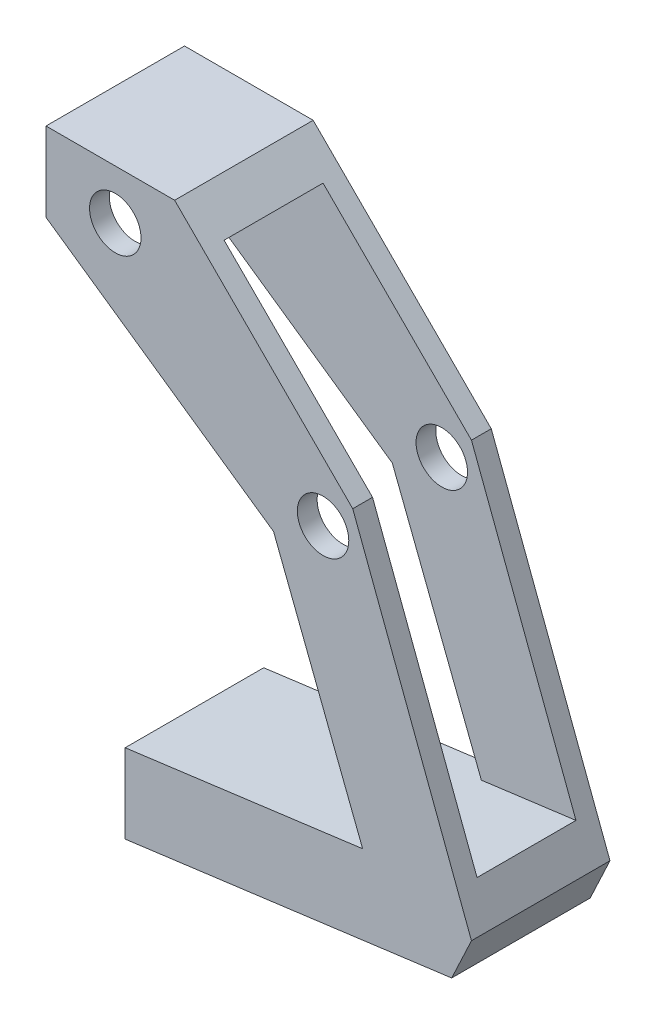
ISO-10303-21;
HEADER;
FILE_DESCRIPTION(('STEP AP214'),'2;1');
FILE_NAME('part.step','',(''),(''),'','','');
FILE_SCHEMA(('AUTOMOTIVE_DESIGN { 1 0 10303 214 1 1 1 1 }'));
ENDSEC;
DATA;
#1=APPLICATION_CONTEXT('core data for automotive mechanical design processes');
#2=APPLICATION_PROTOCOL_DEFINITION('international standard','automotive_design',2000,#1);
#3=PRODUCT_CONTEXT('',#1,'mechanical');
#4=PRODUCT('Part','Part','',(#3));
#5=PRODUCT_RELATED_PRODUCT_CATEGORY('part','',(#4));
#6=PRODUCT_DEFINITION_FORMATION('','',#4);
#7=PRODUCT_DEFINITION_CONTEXT('part definition',#1,'design');
#8=PRODUCT_DEFINITION('design','',#6,#7);
#9=PRODUCT_DEFINITION_SHAPE('','',#8);
#10=(LENGTH_UNIT() NAMED_UNIT(*) SI_UNIT(.MILLI.,.METRE.));
#11=(NAMED_UNIT(*) PLANE_ANGLE_UNIT() SI_UNIT($,.RADIAN.));
#12=(NAMED_UNIT(*) SI_UNIT($,.STERADIAN.) SOLID_ANGLE_UNIT());
#13=UNCERTAINTY_MEASURE_WITH_UNIT(LENGTH_MEASURE(1.E-05),#10,'distance_accuracy_value','');
#14=(GEOMETRIC_REPRESENTATION_CONTEXT(3) GLOBAL_UNCERTAINTY_ASSIGNED_CONTEXT((#13)) GLOBAL_UNIT_ASSIGNED_CONTEXT((#10,
#11,#12)) REPRESENTATION_CONTEXT('',''));
#15=CARTESIAN_POINT('',(0.,0.,0.));
#16=DIRECTION('',(0.,0.,1.));
#17=DIRECTION('',(1.,0.,0.));
#18=AXIS2_PLACEMENT_3D('',#15,#16,#17);
#19=CARTESIAN_POINT('',(65.,57.,2.));
#20=DIRECTION('',(0.,1.,0.));
#21=DIRECTION('',(0.,0.,1.));
#22=AXIS2_PLACEMENT_3D('',#19,#20,#21);
#23=PLANE('',#22);
#24=DIRECTION('',(-1.,0.,0.));
#25=VECTOR('',#24,1.);
#26=CARTESIAN_POINT('',(65.,57.,2.));
#27=LINE('',#26,#25);
#28=CARTESIAN_POINT('',(17.3386752274164,57.,2.));
#29=VERTEX_POINT('',#28);
#30=CARTESIAN_POINT('',(12.,57.,2.));
#31=VERTEX_POINT('',#30);
#32=EDGE_CURVE('E177',#29,#31,#27,.T.);
#33=ORIENTED_EDGE('',*,*,#32,.F.);
#34=DIRECTION('',(0.,0.,1.));
#35=VECTOR('',#34,1.);
#36=CARTESIAN_POINT('',(17.3386752274164,57.,0.));
#37=LINE('',#36,#35);
#38=CARTESIAN_POINT('',(17.3386752274164,57.,12.));
#39=VERTEX_POINT('',#38);
#40=EDGE_CURVE('E168',#29,#39,#37,.T.);
#41=ORIENTED_EDGE('',*,*,#40,.T.);
#42=DIRECTION('',(-1.,0.,0.));
#43=VECTOR('',#42,1.);
#44=CARTESIAN_POINT('',(65.,57.,12.));
#45=LINE('',#44,#43);
#46=CARTESIAN_POINT('',(12.,57.,12.));
#47=VERTEX_POINT('',#46);
#48=EDGE_CURVE('E175',#39,#47,#45,.T.);
#49=ORIENTED_EDGE('',*,*,#48,.T.);
#50=DIRECTION('',(0.,0.,1.));
#51=VECTOR('',#50,1.);
#52=CARTESIAN_POINT('',(12.,57.,14.));
#53=LINE('',#52,#51);
#54=EDGE_CURVE('E212',#31,#47,#53,.T.);
#55=ORIENTED_EDGE('',*,*,#54,.F.);
#56=EDGE_LOOP('',(#33,#41,#49,#55));
#57=FACE_BOUND('',#56,.T.);
#58=ADVANCED_FACE('F39',(#57),#23,.F.);
#59=CARTESIAN_POINT('',(35.,36.,14.));
#60=DIRECTION('',(0.5710644881986,0.820905201785487,0.));
#61=DIRECTION('',(-0.820905201785487,0.5710644881986,0.));
#62=AXIS2_PLACEMENT_3D('',#59,#60,#61);
#63=PLANE('',#62);
#64=DIRECTION('',(-0.820905201785487,0.5710644881986,0.));
#65=VECTOR('',#64,1.);
#66=CARTESIAN_POINT('',(35.,36.,12.));
#67=LINE('',#66,#65);
#68=CARTESIAN_POINT('',(35.,36.,12.));
#69=VERTEX_POINT('',#68);
#70=CARTESIAN_POINT('',(12.,52.,12.));
#71=VERTEX_POINT('',#70);
#72=EDGE_CURVE('E197',#69,#71,#67,.T.);
#73=ORIENTED_EDGE('',*,*,#72,.F.);
#74=DIRECTION('',(0.,0.,-1.));
#75=VECTOR('',#74,1.);
#76=CARTESIAN_POINT('',(35.,36.,14.));
#77=LINE('',#76,#75);
#78=CARTESIAN_POINT('',(35.,36.,14.));
#79=VERTEX_POINT('',#78);
#80=EDGE_CURVE('E286',#79,#69,#77,.T.);
#81=ORIENTED_EDGE('',*,*,#80,.F.);
#82=DIRECTION('',(0.820905201785487,-0.5710644881986,0.));
#83=VECTOR('',#82,1.);
#84=CARTESIAN_POINT('',(35.,36.,14.));
#85=LINE('',#84,#83);
#86=CARTESIAN_POINT('',(12.,52.,14.));
#87=VERTEX_POINT('',#86);
#88=EDGE_CURVE('E218',#87,#79,#85,.T.);
#89=ORIENTED_EDGE('',*,*,#88,.F.);
#90=DIRECTION('',(0.,0.,-1.));
#91=VECTOR('',#90,1.);
#92=CARTESIAN_POINT('',(12.,52.,14.));
#93=LINE('',#92,#91);
#94=EDGE_CURVE('E290',#87,#71,#93,.T.);
#95=ORIENTED_EDGE('',*,*,#94,.T.);
#96=EDGE_LOOP('',(#73,#81,#89,#95));
#97=FACE_BOUND('',#96,.T.);
#98=ADVANCED_FACE('F377',(#97),#63,.F.);
#99=CARTESIAN_POINT('',(44.,12.7394899131463,14.));
#100=DIRECTION('',(0.932623002789676,0.360852233840346,0.));
#101=DIRECTION('',(-0.360852233840346,0.932623002789676,0.));
#102=AXIS2_PLACEMENT_3D('',#99,#100,#101);
#103=PLANE('',#102);
#104=DIRECTION('',(-0.360852233840346,0.932623002789676,0.));
#105=VECTOR('',#104,1.);
#106=CARTESIAN_POINT('',(44.,12.7394899131463,12.));
#107=LINE('',#106,#105);
#108=CARTESIAN_POINT('',(44.,12.7394899131463,12.));
#109=VERTEX_POINT('',#108);
#110=EDGE_CURVE('E194',#109,#69,#107,.T.);
#111=ORIENTED_EDGE('',*,*,#110,.F.);
#112=DIRECTION('',(0.,0.,-1.));
#113=VECTOR('',#112,1.);
#114=CARTESIAN_POINT('',(44.,12.7394899131463,14.));
#115=LINE('',#114,#113);
#116=CARTESIAN_POINT('',(44.,12.7394899131463,14.));
#117=VERTEX_POINT('',#116);
#118=EDGE_CURVE('E282',#117,#109,#115,.T.);
#119=ORIENTED_EDGE('',*,*,#118,.F.);
#120=DIRECTION('',(0.360852233840346,-0.932623002789676,0.));
#121=VECTOR('',#120,1.);
#122=CARTESIAN_POINT('',(44.,12.7394899131463,14.));
#123=LINE('',#122,#121);
#124=EDGE_CURVE('E221',#79,#117,#123,.T.);
#125=ORIENTED_EDGE('',*,*,#124,.F.);
#126=ORIENTED_EDGE('',*,*,#80,.T.);
#127=EDGE_LOOP('',(#111,#119,#125,#126));
#128=FACE_BOUND('',#127,.T.);
#129=ADVANCED_FACE('F381',(#128),#103,.F.);
#130=CARTESIAN_POINT('',(12.,52.,14.));
#131=DIRECTION('',(1.,0.,0.));
#132=DIRECTION('',(0.,0.,-1.));
#133=AXIS2_PLACEMENT_3D('',#130,#131,#132);
#134=PLANE('',#133);
#135=CARTESIAN_POINT('',(12.,52.,2.));
#136=VERTEX_POINT('',#135);
#137=CARTESIAN_POINT('',(12.,52.,0.));
#138=VERTEX_POINT('',#137);
#139=EDGE_CURVE('E289',#136,#138,#93,.T.);
#140=ORIENTED_EDGE('',*,*,#139,.F.);
#141=DIRECTION('',(0.,1.,0.));
#142=VECTOR('',#141,1.);
#143=CARTESIAN_POINT('',(12.,52.,2.));
#144=LINE('',#143,#142);
#145=EDGE_CURVE('E209',#136,#31,#144,.T.);
#146=ORIENTED_EDGE('',*,*,#145,.T.);
#147=ORIENTED_EDGE('',*,*,#54,.T.);
#148=DIRECTION('',(0.,1.,0.));
#149=VECTOR('',#148,1.);
#150=CARTESIAN_POINT('',(12.,52.,12.));
#151=LINE('',#150,#149);
#152=EDGE_CURVE('E183',#71,#47,#151,.T.);
#153=ORIENTED_EDGE('',*,*,#152,.F.);
#154=ORIENTED_EDGE('',*,*,#94,.F.);
#155=DIRECTION('',(0.,-1.,0.));
#156=VECTOR('',#155,1.);
#157=CARTESIAN_POINT('',(12.,52.,14.));
#158=LINE('',#157,#156);
#159=CARTESIAN_POINT('',(12.,60.,14.));
#160=VERTEX_POINT('',#159);
#161=EDGE_CURVE('E215',#160,#87,#158,.T.);
#162=ORIENTED_EDGE('',*,*,#161,.F.);
#163=DIRECTION('',(0.,0.,-1.));
#164=VECTOR('',#163,1.);
#165=CARTESIAN_POINT('',(12.,60.,14.));
#166=LINE('',#165,#164);
#167=CARTESIAN_POINT('',(12.,60.,0.));
#168=VERTEX_POINT('',#167);
#169=EDGE_CURVE('E237',#160,#168,#166,.T.);
#170=ORIENTED_EDGE('',*,*,#169,.T.);
#171=DIRECTION('',(0.,-1.,0.));
#172=VECTOR('',#171,1.);
#173=CARTESIAN_POINT('',(12.,52.,0.));
#174=LINE('',#173,#172);
#175=EDGE_CURVE('E214',#168,#138,#174,.T.);
#176=ORIENTED_EDGE('',*,*,#175,.T.);
#177=EDGE_LOOP('',(#140,#146,#147,#153,#154,#162,#170,#176));
#178=FACE_BOUND('',#177,.T.);
#179=ADVANCED_FACE('F41',(#178),#134,.F.);
#180=CARTESIAN_POINT('',(35.,36.,2.));
#181=VERTEX_POINT('',#180);
#182=CARTESIAN_POINT('',(35.,36.,0.));
#183=VERTEX_POINT('',#182);
#184=EDGE_CURVE('E285',#181,#183,#77,.T.);
#185=ORIENTED_EDGE('',*,*,#184,.F.);
#186=DIRECTION('',(-0.820905201785487,0.5710644881986,0.));
#187=VECTOR('',#186,1.);
#188=CARTESIAN_POINT('',(35.,36.,2.));
#189=LINE('',#188,#187);
#190=EDGE_CURVE('E206',#181,#136,#189,.T.);
#191=ORIENTED_EDGE('',*,*,#190,.T.);
#192=ORIENTED_EDGE('',*,*,#139,.T.);
#193=DIRECTION('',(0.820905201785487,-0.5710644881986,0.));
#194=VECTOR('',#193,1.);
#195=CARTESIAN_POINT('',(35.,36.,0.));
#196=LINE('',#195,#194);
#197=EDGE_CURVE('E240',#138,#183,#196,.T.);
#198=ORIENTED_EDGE('',*,*,#197,.T.);
#199=EDGE_LOOP('',(#185,#191,#192,#198));
#200=FACE_BOUND('',#199,.T.);
#201=ADVANCED_FACE('F329',(#200),#63,.F.);
#202=CARTESIAN_POINT('',(44.,12.7394899131462,2.));
#203=VERTEX_POINT('',#202);
#204=CARTESIAN_POINT('',(44.,12.7394899131463,0.));
#205=VERTEX_POINT('',#204);
#206=EDGE_CURVE('E281',#203,#205,#115,.T.);
#207=ORIENTED_EDGE('',*,*,#206,.F.);
#208=DIRECTION('',(-0.360852233840346,0.932623002789676,0.));
#209=VECTOR('',#208,1.);
#210=CARTESIAN_POINT('',(44.,12.7394899131463,2.));
#211=LINE('',#210,#209);
#212=EDGE_CURVE('E203',#203,#181,#211,.T.);
#213=ORIENTED_EDGE('',*,*,#212,.T.);
#214=ORIENTED_EDGE('',*,*,#184,.T.);
#215=DIRECTION('',(0.360852233840346,-0.932623002789676,0.));
#216=VECTOR('',#215,1.);
#217=CARTESIAN_POINT('',(44.,12.7394899131463,0.));
#218=LINE('',#217,#216);
#219=EDGE_CURVE('E243',#183,#205,#218,.T.);
#220=ORIENTED_EDGE('',*,*,#219,.T.);
#221=EDGE_LOOP('',(#207,#213,#214,#220));
#222=FACE_BOUND('',#221,.T.);
#223=ADVANCED_FACE('F338',(#222),#103,.F.);
#224=CARTESIAN_POINT('',(20.,9.57982997104875,14.));
#225=DIRECTION('',(0.130526192220052,-0.99144486137381,0.));
#226=DIRECTION('',(0.99144486137381,0.130526192220052,0.));
#227=AXIS2_PLACEMENT_3D('',#224,#225,#226);
#228=PLANE('',#227);
#229=DIRECTION('',(-0.99144486137381,-0.130526192220052,0.));
#230=VECTOR('',#229,1.);
#231=CARTESIAN_POINT('',(20.,9.57982997104875,0.));
#232=LINE('',#231,#230);
#233=CARTESIAN_POINT('',(20.,9.57982997104875,0.));
#234=VERTEX_POINT('',#233);
#235=EDGE_CURVE('E246',#205,#234,#232,.T.);
#236=ORIENTED_EDGE('',*,*,#235,.T.);
#237=DIRECTION('',(0.,0.,-1.));
#238=VECTOR('',#237,1.);
#239=CARTESIAN_POINT('',(20.,9.57982997104875,14.));
#240=LINE('',#239,#238);
#241=CARTESIAN_POINT('',(20.,9.57982997104875,14.));
#242=VERTEX_POINT('',#241);
#243=EDGE_CURVE('E279',#242,#234,#240,.T.);
#244=ORIENTED_EDGE('',*,*,#243,.F.);
#245=DIRECTION('',(-0.99144486137381,-0.130526192220052,0.));
#246=VECTOR('',#245,1.);
#247=CARTESIAN_POINT('',(20.,9.57982997104875,14.));
#248=LINE('',#247,#246);
#249=EDGE_CURVE('E223',#117,#242,#248,.T.);
#250=ORIENTED_EDGE('',*,*,#249,.F.);
#251=ORIENTED_EDGE('',*,*,#118,.T.);
#252=DIRECTION('',(0.99144486137381,0.130526192220052,0.));
#253=VECTOR('',#252,1.);
#254=CARTESIAN_POINT('',(-5.,6.28851753136385,12.));
#255=LINE('',#254,#253);
#256=CARTESIAN_POINT('',(53.5625369462484,13.9984217853916,12.));
#257=VERTEX_POINT('',#256);
#258=EDGE_CURVE('E61',#109,#257,#255,.T.);
#259=ORIENTED_EDGE('',*,*,#258,.T.);
#260=DIRECTION('',(0.,0.,1.));
#261=VECTOR('',#260,1.);
#262=CARTESIAN_POINT('',(53.5625369462484,13.9984217853916,14.));
#263=LINE('',#262,#261);
#264=CARTESIAN_POINT('',(53.5625369462484,13.9984217853916,2.));
#265=VERTEX_POINT('',#264);
#266=EDGE_CURVE('E47',#265,#257,#263,.T.);
#267=ORIENTED_EDGE('',*,*,#266,.F.);
#268=DIRECTION('',(0.99144486137381,0.130526192220052,0.));
#269=VECTOR('',#268,1.);
#270=CARTESIAN_POINT('',(-5.,6.28851753136385,2.));
#271=LINE('',#270,#269);
#272=EDGE_CURVE('E187',#203,#265,#271,.T.);
#273=ORIENTED_EDGE('',*,*,#272,.F.);
#274=ORIENTED_EDGE('',*,*,#206,.T.);
#275=EDGE_LOOP('',(#236,#244,#250,#251,#259,#267,#273,#274));
#276=FACE_BOUND('',#275,.T.);
#277=ADVANCED_FACE('F341',(#276),#228,.F.);
#278=CARTESIAN_POINT('',(20.,1.57982997104875,14.));
#279=DIRECTION('',(1.,0.,0.));
#280=DIRECTION('',(0.,0.,-1.));
#281=AXIS2_PLACEMENT_3D('',#278,#279,#280);
#282=PLANE('',#281);
#283=DIRECTION('',(0.,-1.,0.));
#284=VECTOR('',#283,1.);
#285=CARTESIAN_POINT('',(20.,1.57982997104875,0.));
#286=LINE('',#285,#284);
#287=CARTESIAN_POINT('',(20.,1.57982997104875,0.));
#288=VERTEX_POINT('',#287);
#289=EDGE_CURVE('E249',#234,#288,#286,.T.);
#290=ORIENTED_EDGE('',*,*,#289,.T.);
#291=DIRECTION('',(0.,0.,-1.));
#292=VECTOR('',#291,1.);
#293=CARTESIAN_POINT('',(20.,1.57982997104875,14.));
#294=LINE('',#293,#292);
#295=CARTESIAN_POINT('',(20.,1.57982997104875,14.));
#296=VERTEX_POINT('',#295);
#297=EDGE_CURVE('E276',#296,#288,#294,.T.);
#298=ORIENTED_EDGE('',*,*,#297,.F.);
#299=DIRECTION('',(0.,-1.,0.));
#300=VECTOR('',#299,1.);
#301=CARTESIAN_POINT('',(20.,1.57982997104875,14.));
#302=LINE('',#301,#300);
#303=EDGE_CURVE('E225',#242,#296,#302,.T.);
#304=ORIENTED_EDGE('',*,*,#303,.F.);
#305=ORIENTED_EDGE('',*,*,#243,.T.);
#306=EDGE_LOOP('',(#290,#298,#304,#305));
#307=FACE_BOUND('',#306,.T.);
#308=ADVANCED_FACE('F387',(#307),#282,.F.);
#309=CARTESIAN_POINT('',(53.,5.92436239143281,14.));
#310=DIRECTION('',(-0.130526192220052,0.99144486137381,0.));
#311=DIRECTION('',(-0.99144486137381,-0.130526192220052,0.));
#312=AXIS2_PLACEMENT_3D('',#309,#310,#311);
#313=PLANE('',#312);
#314=DIRECTION('',(0.99144486137381,0.130526192220052,0.));
#315=VECTOR('',#314,1.);
#316=CARTESIAN_POINT('',(53.,5.92436239143281,0.));
#317=LINE('',#316,#315);
#318=CARTESIAN_POINT('',(53.,5.92436239143281,0.));
#319=VERTEX_POINT('',#318);
#320=EDGE_CURVE('E251',#288,#319,#317,.T.);
#321=ORIENTED_EDGE('',*,*,#320,.T.);
#322=DIRECTION('',(0.,0.,-1.));
#323=VECTOR('',#322,1.);
#324=CARTESIAN_POINT('',(53.,5.92436239143281,14.));
#325=LINE('',#324,#323);
#326=CARTESIAN_POINT('',(53.,5.92436239143281,14.));
#327=VERTEX_POINT('',#326);
#328=EDGE_CURVE('E273',#327,#319,#325,.T.);
#329=ORIENTED_EDGE('',*,*,#328,.F.);
#330=DIRECTION('',(0.99144486137381,0.130526192220052,0.));
#331=VECTOR('',#330,1.);
#332=CARTESIAN_POINT('',(53.,5.92436239143281,14.));
#333=LINE('',#332,#331);
#334=EDGE_CURVE('E227',#296,#327,#333,.T.);
#335=ORIENTED_EDGE('',*,*,#334,.F.);
#336=ORIENTED_EDGE('',*,*,#297,.T.);
#337=EDGE_LOOP('',(#321,#329,#335,#336));
#338=FACE_BOUND('',#337,.T.);
#339=ADVANCED_FACE('F392',(#338),#313,.F.);
#340=CARTESIAN_POINT('',(55.,10.1876673866076,14.));
#341=DIRECTION('',(-0.905330295868163,0.424708200277867,0.));
#342=DIRECTION('',(-0.424708200277867,-0.905330295868163,0.));
#343=AXIS2_PLACEMENT_3D('',#340,#341,#342);
#344=PLANE('',#343);
#345=DIRECTION('',(0.424708200277867,0.905330295868163,0.));
#346=VECTOR('',#345,1.);
#347=CARTESIAN_POINT('',(55.,10.1876673866076,0.));
#348=LINE('',#347,#346);
#349=CARTESIAN_POINT('',(55.,10.1876673866076,0.));
#350=VERTEX_POINT('',#349);
#351=EDGE_CURVE('E253',#319,#350,#348,.T.);
#352=ORIENTED_EDGE('',*,*,#351,.T.);
#353=DIRECTION('',(0.,0.,-1.));
#354=VECTOR('',#353,1.);
#355=CARTESIAN_POINT('',(55.,10.1876673866076,14.));
#356=LINE('',#355,#354);
#357=CARTESIAN_POINT('',(55.,10.1876673866076,14.));
#358=VERTEX_POINT('',#357);
#359=EDGE_CURVE('E270',#358,#350,#356,.T.);
#360=ORIENTED_EDGE('',*,*,#359,.F.);
#361=DIRECTION('',(0.424708200277867,0.905330295868163,0.));
#362=VECTOR('',#361,1.);
#363=CARTESIAN_POINT('',(55.,10.1876673866076,14.));
#364=LINE('',#363,#362);
#365=EDGE_CURVE('E229',#327,#358,#364,.T.);
#366=ORIENTED_EDGE('',*,*,#365,.F.);
#367=ORIENTED_EDGE('',*,*,#328,.T.);
#368=EDGE_LOOP('',(#352,#360,#366,#367));
#369=FACE_BOUND('',#368,.T.);
#370=ADVANCED_FACE('F397',(#369),#344,.F.);
#371=CARTESIAN_POINT('',(43.,42.,14.));
#372=DIRECTION('',(-0.935646924127684,-0.352937435490208,0.));
#373=DIRECTION('',(0.352937435490208,-0.935646924127684,0.));
#374=AXIS2_PLACEMENT_3D('',#371,#372,#373);
#375=PLANE('',#374);
#376=DIRECTION('',(0.,0.,-1.));
#377=VECTOR('',#376,1.);
#378=CARTESIAN_POINT('',(43.,42.,14.));
#379=LINE('',#378,#377);
#380=CARTESIAN_POINT('',(43.,42.,2.));
#381=VERTEX_POINT('',#380);
#382=CARTESIAN_POINT('',(43.,42.,0.));
#383=VERTEX_POINT('',#382);
#384=EDGE_CURVE('E266',#381,#383,#379,.T.);
#385=ORIENTED_EDGE('',*,*,#384,.F.);
#386=DIRECTION('',(0.352937435490208,-0.935646924127684,0.));
#387=VECTOR('',#386,1.);
#388=CARTESIAN_POINT('',(43.,42.,2.));
#389=LINE('',#388,#387);
#390=EDGE_CURVE('E200',#381,#265,#389,.T.);
#391=ORIENTED_EDGE('',*,*,#390,.T.);
#392=ORIENTED_EDGE('',*,*,#266,.T.);
#393=DIRECTION('',(0.352937435490208,-0.935646924127684,0.));
#394=VECTOR('',#393,1.);
#395=CARTESIAN_POINT('',(43.,42.,12.));
#396=LINE('',#395,#394);
#397=CARTESIAN_POINT('',(43.,42.,12.));
#398=VERTEX_POINT('',#397);
#399=EDGE_CURVE('E192',#398,#257,#396,.T.);
#400=ORIENTED_EDGE('',*,*,#399,.F.);
#401=CARTESIAN_POINT('',(43.,42.,14.));
#402=VERTEX_POINT('',#401);
#403=EDGE_CURVE('E267',#402,#398,#379,.T.);
#404=ORIENTED_EDGE('',*,*,#403,.F.);
#405=DIRECTION('',(-0.352937435490208,0.935646924127684,0.));
#406=VECTOR('',#405,1.);
#407=CARTESIAN_POINT('',(43.,42.,14.));
#408=LINE('',#407,#406);
#409=EDGE_CURVE('E231',#358,#402,#408,.T.);
#410=ORIENTED_EDGE('',*,*,#409,.F.);
#411=ORIENTED_EDGE('',*,*,#359,.T.);
#412=DIRECTION('',(-0.352937435490208,0.935646924127684,0.));
#413=VECTOR('',#412,1.);
#414=CARTESIAN_POINT('',(43.,42.,0.));
#415=LINE('',#414,#413);
#416=EDGE_CURVE('E255',#350,#383,#415,.T.);
#417=ORIENTED_EDGE('',*,*,#416,.T.);
#418=EDGE_LOOP('',(#385,#391,#392,#400,#404,#410,#411,#417));
#419=FACE_BOUND('',#418,.T.);
#420=ADVANCED_FACE('F345',(#419),#375,.F.);
#421=CARTESIAN_POINT('',(25.,60.,14.));
#422=DIRECTION('',(-0.707106781186548,-0.707106781186548,0.));
#423=DIRECTION('',(0.707106781186548,-0.707106781186548,0.));
#424=AXIS2_PLACEMENT_3D('',#421,#422,#423);
#425=PLANE('',#424);
#426=DIRECTION('',(0.,0.,-1.));
#427=VECTOR('',#426,1.);
#428=CARTESIAN_POINT('',(28.,57.,14.));
#429=LINE('',#428,#427);
#430=CARTESIAN_POINT('',(28.,57.,12.));
#431=VERTEX_POINT('',#430);
#432=CARTESIAN_POINT('',(28.,57.,2.));
#433=VERTEX_POINT('',#432);
#434=EDGE_CURVE('E295',#431,#433,#429,.T.);
#435=ORIENTED_EDGE('',*,*,#434,.T.);
#436=DIRECTION('',(0.707106781186548,-0.707106781186548,0.));
#437=VECTOR('',#436,1.);
#438=CARTESIAN_POINT('',(25.,60.,2.));
#439=LINE('',#438,#437);
#440=EDGE_CURVE('E298',#433,#381,#439,.T.);
#441=ORIENTED_EDGE('',*,*,#440,.T.);
#442=ORIENTED_EDGE('',*,*,#384,.T.);
#443=DIRECTION('',(-0.707106781186547,0.707106781186547,0.));
#444=VECTOR('',#443,1.);
#445=CARTESIAN_POINT('',(25.,60.,0.));
#446=LINE('',#445,#444);
#447=CARTESIAN_POINT('',(25.,60.,0.));
#448=VERTEX_POINT('',#447);
#449=EDGE_CURVE('E258',#383,#448,#446,.T.);
#450=ORIENTED_EDGE('',*,*,#449,.T.);
#451=DIRECTION('',(0.,0.,-1.));
#452=VECTOR('',#451,1.);
#453=CARTESIAN_POINT('',(25.,60.,14.));
#454=LINE('',#453,#452);
#455=CARTESIAN_POINT('',(25.,60.,14.));
#456=VERTEX_POINT('',#455);
#457=EDGE_CURVE('E263',#456,#448,#454,.T.);
#458=ORIENTED_EDGE('',*,*,#457,.F.);
#459=DIRECTION('',(-0.707106781186547,0.707106781186547,0.));
#460=VECTOR('',#459,1.);
#461=CARTESIAN_POINT('',(25.,60.,14.));
#462=LINE('',#461,#460);
#463=EDGE_CURVE('E233',#402,#456,#462,.T.);
#464=ORIENTED_EDGE('',*,*,#463,.F.);
#465=ORIENTED_EDGE('',*,*,#403,.T.);
#466=DIRECTION('',(0.707106781186548,-0.707106781186548,0.));
#467=VECTOR('',#466,1.);
#468=CARTESIAN_POINT('',(25.,60.,12.));
#469=LINE('',#468,#467);
#470=EDGE_CURVE('E293',#431,#398,#469,.T.);
#471=ORIENTED_EDGE('',*,*,#470,.F.);
#472=EDGE_LOOP('',(#435,#441,#442,#450,#458,#464,#465,#471));
#473=FACE_BOUND('',#472,.T.);
#474=ADVANCED_FACE('F348',(#473),#425,.F.);
#475=CARTESIAN_POINT('',(12.,60.,14.));
#476=DIRECTION('',(0.,-1.,0.));
#477=DIRECTION('',(0.,0.,-1.));
#478=AXIS2_PLACEMENT_3D('',#475,#476,#477);
#479=PLANE('',#478);
#480=DIRECTION('',(-1.,0.,0.));
#481=VECTOR('',#480,1.);
#482=CARTESIAN_POINT('',(12.,60.,0.));
#483=LINE('',#482,#481);
#484=EDGE_CURVE('E219',#448,#168,#483,.T.);
#485=ORIENTED_EDGE('',*,*,#484,.T.);
#486=ORIENTED_EDGE('',*,*,#169,.F.);
#487=DIRECTION('',(-1.,0.,0.));
#488=VECTOR('',#487,1.);
#489=CARTESIAN_POINT('',(12.,60.,14.));
#490=LINE('',#489,#488);
#491=EDGE_CURVE('E235',#456,#160,#490,.T.);
#492=ORIENTED_EDGE('',*,*,#491,.F.);
#493=ORIENTED_EDGE('',*,*,#457,.T.);
#494=EDGE_LOOP('',(#485,#486,#492,#493));
#495=FACE_BOUND('',#494,.T.);
#496=ADVANCED_FACE('F366',(#495),#479,.F.);
#497=CARTESIAN_POINT('',(0.,0.,14.));
#498=DIRECTION('',(0.,0.,-1.));
#499=DIRECTION('',(-1.,0.,0.));
#500=AXIS2_PLACEMENT_3D('',#497,#498,#499);
#501=PLANE('',#500);
#502=CARTESIAN_POINT('',(19.,55.,14.));
#503=DIRECTION('',(0.,0.,1.));
#504=DIRECTION('',(1.,0.,0.));
#505=AXIS2_PLACEMENT_3D('',#502,#503,#504);
#506=CIRCLE('',#505,2.6);
#507=CARTESIAN_POINT('',(21.6,55.,14.));
#508=VERTEX_POINT('',#507);
#509=EDGE_CURVE('E356',#508,#508,#506,.T.);
#510=ORIENTED_EDGE('',*,*,#509,.F.);
#511=EDGE_LOOP('',(#510));
#512=FACE_BOUND('',#511,.T.);
#513=CARTESIAN_POINT('',(40.,39.,14.));
#514=DIRECTION('',(0.,0.,1.));
#515=DIRECTION('',(1.,0.,0.));
#516=AXIS2_PLACEMENT_3D('',#513,#514,#515);
#517=CIRCLE('',#516,2.6);
#518=CARTESIAN_POINT('',(42.6,39.,14.));
#519=VERTEX_POINT('',#518);
#520=EDGE_CURVE('E310',#519,#519,#517,.T.);
#521=ORIENTED_EDGE('',*,*,#520,.F.);
#522=EDGE_LOOP('',(#521));
#523=FACE_BOUND('',#522,.T.);
#524=ORIENTED_EDGE('',*,*,#161,.T.);
#525=ORIENTED_EDGE('',*,*,#88,.T.);
#526=ORIENTED_EDGE('',*,*,#124,.T.);
#527=ORIENTED_EDGE('',*,*,#249,.T.);
#528=ORIENTED_EDGE('',*,*,#303,.T.);
#529=ORIENTED_EDGE('',*,*,#334,.T.);
#530=ORIENTED_EDGE('',*,*,#365,.T.);
#531=ORIENTED_EDGE('',*,*,#409,.T.);
#532=ORIENTED_EDGE('',*,*,#463,.T.);
#533=ORIENTED_EDGE('',*,*,#491,.T.);
#534=EDGE_LOOP('',(#524,#525,#526,#527,#528,#529,#530,#531,#532,#533));
#535=FACE_BOUND('',#534,.T.);
#536=ADVANCED_FACE('F363',(#512,#523,#535),#501,.F.);
#537=CARTESIAN_POINT('',(0.,0.,0.));
#538=DIRECTION('',(0.,0.,-1.));
#539=DIRECTION('',(-1.,0.,0.));
#540=AXIS2_PLACEMENT_3D('',#537,#538,#539);
#541=PLANE('',#540);
#542=CARTESIAN_POINT('',(19.,55.,0.));
#543=DIRECTION('',(0.,0.,1.));
#544=DIRECTION('',(1.,0.,0.));
#545=AXIS2_PLACEMENT_3D('',#542,#543,#544);
#546=CIRCLE('',#545,2.6);
#547=CARTESIAN_POINT('',(21.6,55.,0.));
#548=VERTEX_POINT('',#547);
#549=EDGE_CURVE('E353',#548,#548,#546,.T.);
#550=ORIENTED_EDGE('',*,*,#549,.T.);
#551=EDGE_LOOP('',(#550));
#552=FACE_BOUND('',#551,.T.);
#553=CARTESIAN_POINT('',(40.,39.,0.));
#554=DIRECTION('',(0.,0.,1.));
#555=DIRECTION('',(1.,0.,0.));
#556=AXIS2_PLACEMENT_3D('',#553,#554,#555);
#557=CIRCLE('',#556,2.6);
#558=CARTESIAN_POINT('',(42.6,39.,0.));
#559=VERTEX_POINT('',#558);
#560=EDGE_CURVE('E304',#559,#559,#557,.T.);
#561=ORIENTED_EDGE('',*,*,#560,.T.);
#562=EDGE_LOOP('',(#561));
#563=FACE_BOUND('',#562,.T.);
#564=ORIENTED_EDGE('',*,*,#175,.F.);
#565=ORIENTED_EDGE('',*,*,#484,.F.);
#566=ORIENTED_EDGE('',*,*,#449,.F.);
#567=ORIENTED_EDGE('',*,*,#416,.F.);
#568=ORIENTED_EDGE('',*,*,#351,.F.);
#569=ORIENTED_EDGE('',*,*,#320,.F.);
#570=ORIENTED_EDGE('',*,*,#289,.F.);
#571=ORIENTED_EDGE('',*,*,#235,.F.);
#572=ORIENTED_EDGE('',*,*,#219,.F.);
#573=ORIENTED_EDGE('',*,*,#197,.F.);
#574=EDGE_LOOP('',(#564,#565,#566,#567,#568,#569,#570,#571,#572,#573));
#575=FACE_BOUND('',#574,.T.);
#576=ADVANCED_FACE('F332',(#552,#563,#575),#541,.T.);
#577=CARTESIAN_POINT('',(20.6613247725836,57.,12.));
#578=VERTEX_POINT('',#577);
#579=EDGE_CURVE('E185',#431,#578,#45,.T.);
#580=ORIENTED_EDGE('',*,*,#579,.T.);
#581=DIRECTION('',(0.,0.,1.));
#582=VECTOR('',#581,1.);
#583=CARTESIAN_POINT('',(20.6613247725836,57.,0.));
#584=LINE('',#583,#582);
#585=CARTESIAN_POINT('',(20.6613247725836,57.,2.));
#586=VERTEX_POINT('',#585);
#587=EDGE_CURVE('E53',#578,#586,#584,.F.);
#588=ORIENTED_EDGE('',*,*,#587,.T.);
#589=EDGE_CURVE('E195',#433,#586,#27,.T.);
#590=ORIENTED_EDGE('',*,*,#589,.F.);
#591=ORIENTED_EDGE('',*,*,#434,.F.);
#592=EDGE_LOOP('',(#580,#588,#590,#591));
#593=FACE_BOUND('',#592,.T.);
#594=ADVANCED_FACE('F352',(#593),#23,.F.);
#595=CARTESIAN_POINT('',(0.,0.,2.));
#596=DIRECTION('',(0.,0.,-1.));
#597=DIRECTION('',(-1.,0.,0.));
#598=AXIS2_PLACEMENT_3D('',#595,#596,#597);
#599=PLANE('',#598);
#600=CARTESIAN_POINT('',(40.,39.,2.));
#601=DIRECTION('',(0.,0.,-1.));
#602=DIRECTION('',(-1.,0.,0.));
#603=AXIS2_PLACEMENT_3D('',#600,#601,#602);
#604=CIRCLE('',#603,2.6);
#605=CARTESIAN_POINT('',(37.4,39.,2.));
#606=VERTEX_POINT('',#605);
#607=EDGE_CURVE('E188',#606,#606,#604,.T.);
#608=ORIENTED_EDGE('',*,*,#607,.T.);
#609=EDGE_LOOP('',(#608));
#610=FACE_BOUND('',#609,.T.);
#611=ORIENTED_EDGE('',*,*,#589,.T.);
#612=CARTESIAN_POINT('',(19.,55.,2.));
#613=DIRECTION('',(0.,0.,-1.));
#614=DIRECTION('',(-1.,0.,0.));
#615=AXIS2_PLACEMENT_3D('',#612,#613,#614);
#616=CIRCLE('',#615,2.6);
#617=EDGE_CURVE('E178',#586,#29,#616,.T.);
#618=ORIENTED_EDGE('',*,*,#617,.T.);
#619=ORIENTED_EDGE('',*,*,#32,.T.);
#620=ORIENTED_EDGE('',*,*,#145,.F.);
#621=ORIENTED_EDGE('',*,*,#190,.F.);
#622=ORIENTED_EDGE('',*,*,#212,.F.);
#623=ORIENTED_EDGE('',*,*,#272,.T.);
#624=ORIENTED_EDGE('',*,*,#390,.F.);
#625=ORIENTED_EDGE('',*,*,#440,.F.);
#626=EDGE_LOOP('',(#611,#618,#619,#620,#621,#622,#623,#624,#625));
#627=FACE_BOUND('',#626,.T.);
#628=ADVANCED_FACE('F322',(#610,#627),#599,.F.);
#629=CARTESIAN_POINT('',(0.,0.,12.));
#630=DIRECTION('',(0.,0.,-1.));
#631=DIRECTION('',(-1.,0.,0.));
#632=AXIS2_PLACEMENT_3D('',#629,#630,#631);
#633=PLANE('',#632);
#634=CARTESIAN_POINT('',(19.,55.,12.));
#635=DIRECTION('',(0.,0.,-1.));
#636=DIRECTION('',(-1.,0.,0.));
#637=AXIS2_PLACEMENT_3D('',#634,#635,#636);
#638=CIRCLE('',#637,2.6);
#639=EDGE_CURVE('E11',#578,#39,#638,.T.);
#640=ORIENTED_EDGE('',*,*,#639,.F.);
#641=ORIENTED_EDGE('',*,*,#579,.F.);
#642=ORIENTED_EDGE('',*,*,#470,.T.);
#643=ORIENTED_EDGE('',*,*,#399,.T.);
#644=ORIENTED_EDGE('',*,*,#258,.F.);
#645=ORIENTED_EDGE('',*,*,#110,.T.);
#646=ORIENTED_EDGE('',*,*,#72,.T.);
#647=ORIENTED_EDGE('',*,*,#152,.T.);
#648=ORIENTED_EDGE('',*,*,#48,.F.);
#649=EDGE_LOOP('',(#640,#641,#642,#643,#644,#645,#646,#647,#648));
#650=FACE_BOUND('',#649,.T.);
#651=CARTESIAN_POINT('',(40.,39.,12.));
#652=DIRECTION('',(0.,0.,-1.));
#653=DIRECTION('',(-1.,0.,0.));
#654=AXIS2_PLACEMENT_3D('',#651,#652,#653);
#655=CIRCLE('',#654,2.6);
#656=CARTESIAN_POINT('',(37.4,39.,12.));
#657=VERTEX_POINT('',#656);
#658=EDGE_CURVE('E302',#657,#657,#655,.T.);
#659=ORIENTED_EDGE('',*,*,#658,.F.);
#660=EDGE_LOOP('',(#659));
#661=FACE_BOUND('',#660,.T.);
#662=ADVANCED_FACE('F180',(#650,#661),#633,.T.);
#663=CARTESIAN_POINT('',(40.,39.,0.));
#664=DIRECTION('',(0.,0.,1.));
#665=DIRECTION('',(1.,0.,0.));
#666=AXIS2_PLACEMENT_3D('',#663,#664,#665);
#667=CYLINDRICAL_SURFACE('',#666,2.6);
#668=ORIENTED_EDGE('',*,*,#658,.T.);
#669=EDGE_LOOP('',(#668));
#670=FACE_BOUND('',#669,.T.);
#671=ORIENTED_EDGE('',*,*,#520,.T.);
#672=EDGE_LOOP('',(#671));
#673=FACE_BOUND('',#672,.T.);
#674=ADVANCED_FACE('F435',(#670,#673),#667,.F.);
#675=ORIENTED_EDGE('',*,*,#560,.F.);
#676=EDGE_LOOP('',(#675));
#677=FACE_BOUND('',#676,.T.);
#678=ORIENTED_EDGE('',*,*,#607,.F.);
#679=EDGE_LOOP('',(#678));
#680=FACE_BOUND('',#679,.T.);
#681=ADVANCED_FACE('F430',(#677,#680),#667,.F.);
#682=CARTESIAN_POINT('',(19.,55.,0.));
#683=DIRECTION('',(0.,0.,1.));
#684=DIRECTION('',(1.,0.,0.));
#685=AXIS2_PLACEMENT_3D('',#682,#683,#684);
#686=CYLINDRICAL_SURFACE('',#685,2.6);
#687=ORIENTED_EDGE('',*,*,#549,.F.);
#688=EDGE_LOOP('',(#687));
#689=FACE_BOUND('',#688,.T.);
#690=ORIENTED_EDGE('',*,*,#509,.T.);
#691=EDGE_LOOP('',(#690));
#692=FACE_BOUND('',#691,.T.);
#693=ORIENTED_EDGE('',*,*,#587,.F.);
#694=ORIENTED_EDGE('',*,*,#639,.T.);
#695=ORIENTED_EDGE('',*,*,#40,.F.);
#696=ORIENTED_EDGE('',*,*,#617,.F.);
#697=EDGE_LOOP('',(#693,#694,#695,#696));
#698=FACE_BOUND('',#697,.T.);
#699=ADVANCED_FACE('F167',(#689,#692,#698),#686,.F.);
#700=CLOSED_SHELL('',(#58,#98,#129,#179,#201,#223,#277,#308,#339,#370,#420,#474,#496,#536,#576,
#594,#628,#662,#674,#681,#699));
#701=MANIFOLD_SOLID_BREP('B2',#700);
#702=ADVANCED_BREP_SHAPE_REPRESENTATION('',(#18,#701),#14);
#703=SHAPE_DEFINITION_REPRESENTATION(#9,#702);
ENDSEC;
END-ISO-10303-21;
